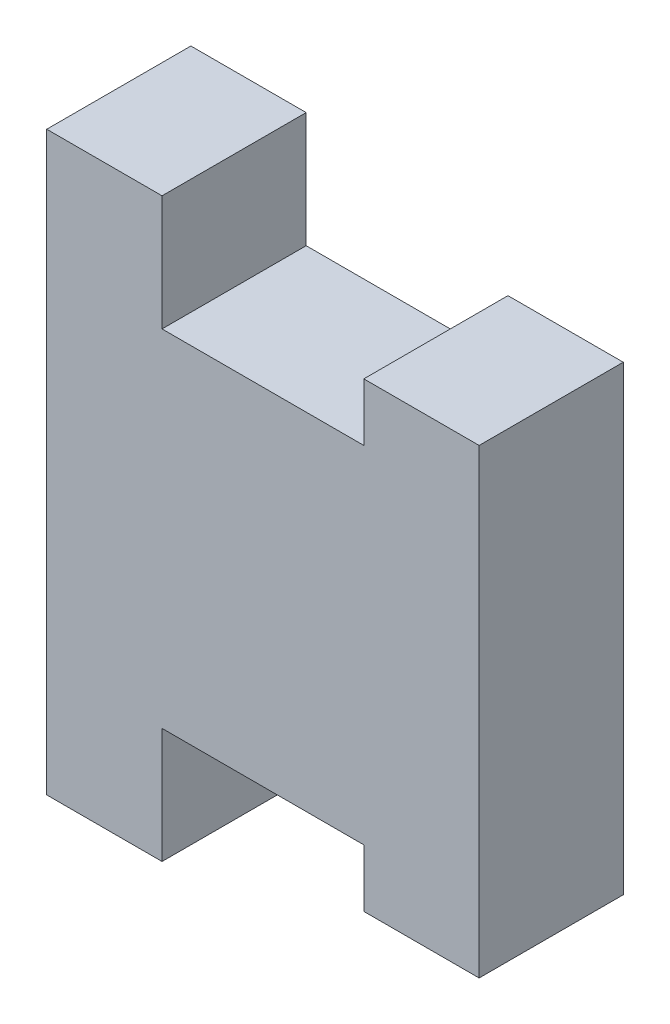
ISO-10303-21;
HEADER;
FILE_DESCRIPTION(('STEP AP214'),'2;1');
FILE_NAME('part.step','',(''),(''),'','','');
FILE_SCHEMA(('AUTOMOTIVE_DESIGN { 1 0 10303 214 1 1 1 1 }'));
ENDSEC;
DATA;
#1=APPLICATION_CONTEXT('core data for automotive mechanical design processes');
#2=APPLICATION_PROTOCOL_DEFINITION('international standard','automotive_design',2000,#1);
#3=PRODUCT_CONTEXT('',#1,'mechanical');
#4=PRODUCT('Part','Part','',(#3));
#5=PRODUCT_RELATED_PRODUCT_CATEGORY('part','',(#4));
#6=PRODUCT_DEFINITION_FORMATION('','',#4);
#7=PRODUCT_DEFINITION_CONTEXT('part definition',#1,'design');
#8=PRODUCT_DEFINITION('design','',#6,#7);
#9=PRODUCT_DEFINITION_SHAPE('','',#8);
#10=(LENGTH_UNIT() NAMED_UNIT(*) SI_UNIT(.MILLI.,.METRE.));
#11=(NAMED_UNIT(*) PLANE_ANGLE_UNIT() SI_UNIT($,.RADIAN.));
#12=(NAMED_UNIT(*) SI_UNIT($,.STERADIAN.) SOLID_ANGLE_UNIT());
#13=UNCERTAINTY_MEASURE_WITH_UNIT(LENGTH_MEASURE(1.E-05),#10,'distance_accuracy_value','');
#14=(GEOMETRIC_REPRESENTATION_CONTEXT(3) GLOBAL_UNCERTAINTY_ASSIGNED_CONTEXT((#13)) GLOBAL_UNIT_ASSIGNED_CONTEXT((#10,
#11,#12)) REPRESENTATION_CONTEXT('',''));
#15=CARTESIAN_POINT('',(0.,0.,0.));
#16=DIRECTION('',(0.,0.,1.));
#17=DIRECTION('',(1.,0.,0.));
#18=AXIS2_PLACEMENT_3D('',#15,#16,#17);
#19=CARTESIAN_POINT('',(0.2,0.,0.125));
#20=DIRECTION('',(0.,1.,0.));
#21=DIRECTION('',(0.,0.,1.));
#22=AXIS2_PLACEMENT_3D('',#19,#20,#21);
#23=PLANE('',#22);
#24=DIRECTION('',(1.,0.,0.));
#25=VECTOR('',#24,1.);
#26=CARTESIAN_POINT('',(0.2,0.,-0.125));
#27=LINE('',#26,#25);
#28=CARTESIAN_POINT('',(0.,0.,-0.125));
#29=VERTEX_POINT('',#28);
#30=CARTESIAN_POINT('',(0.2,0.,-0.125));
#31=VERTEX_POINT('',#30);
#32=EDGE_CURVE('E153',#29,#31,#27,.T.);
#33=ORIENTED_EDGE('',*,*,#32,.T.);
#34=DIRECTION('',(0.,0.,-1.));
#35=VECTOR('',#34,1.);
#36=CARTESIAN_POINT('',(0.2,0.,0.125));
#37=LINE('',#36,#35);
#38=CARTESIAN_POINT('',(0.2,0.,0.125));
#39=VERTEX_POINT('',#38);
#40=EDGE_CURVE('E11',#39,#31,#37,.T.);
#41=ORIENTED_EDGE('',*,*,#40,.F.);
#42=DIRECTION('',(1.,0.,0.));
#43=VECTOR('',#42,1.);
#44=CARTESIAN_POINT('',(0.2,0.,0.125));
#45=LINE('',#44,#43);
#46=CARTESIAN_POINT('',(0.,0.,0.125));
#47=VERTEX_POINT('',#46);
#48=EDGE_CURVE('E175',#47,#39,#45,.T.);
#49=ORIENTED_EDGE('',*,*,#48,.F.);
#50=DIRECTION('',(0.,0.,-1.));
#51=VECTOR('',#50,1.);
#52=CARTESIAN_POINT('',(0.,0.,0.125));
#53=LINE('',#52,#51);
#54=EDGE_CURVE('E149',#47,#29,#53,.T.);
#55=ORIENTED_EDGE('',*,*,#54,.T.);
#56=EDGE_LOOP('',(#33,#41,#49,#55));
#57=FACE_BOUND('',#56,.T.);
#58=ADVANCED_FACE('F33',(#57),#23,.F.);
#59=CARTESIAN_POINT('',(0.2,0.2,0.125));
#60=DIRECTION('',(-1.,0.,0.));
#61=DIRECTION('',(0.,-1.,0.));
#62=AXIS2_PLACEMENT_3D('',#59,#60,#61);
#63=PLANE('',#62);
#64=DIRECTION('',(0.,1.,0.));
#65=VECTOR('',#64,1.);
#66=CARTESIAN_POINT('',(0.2,0.2,-0.125));
#67=LINE('',#66,#65);
#68=CARTESIAN_POINT('',(0.2,0.2,-0.125));
#69=VERTEX_POINT('',#68);
#70=EDGE_CURVE('E156',#31,#69,#67,.T.);
#71=ORIENTED_EDGE('',*,*,#70,.T.);
#72=DIRECTION('',(0.,0.,-1.));
#73=VECTOR('',#72,1.);
#74=CARTESIAN_POINT('',(0.2,0.2,0.125));
#75=LINE('',#74,#73);
#76=CARTESIAN_POINT('',(0.2,0.2,0.125));
#77=VERTEX_POINT('',#76);
#78=EDGE_CURVE('E41',#77,#69,#75,.T.);
#79=ORIENTED_EDGE('',*,*,#78,.F.);
#80=DIRECTION('',(0.,1.,0.));
#81=VECTOR('',#80,1.);
#82=CARTESIAN_POINT('',(0.2,0.2,0.125));
#83=LINE('',#82,#81);
#84=EDGE_CURVE('E104',#39,#77,#83,.T.);
#85=ORIENTED_EDGE('',*,*,#84,.F.);
#86=ORIENTED_EDGE('',*,*,#40,.T.);
#87=EDGE_LOOP('',(#71,#79,#85,#86));
#88=FACE_BOUND('',#87,.T.);
#89=ADVANCED_FACE('F253',(#88),#63,.F.);
#90=CARTESIAN_POINT('',(0.55,0.2,0.125));
#91=DIRECTION('',(0.,1.,0.));
#92=DIRECTION('',(0.,0.,1.));
#93=AXIS2_PLACEMENT_3D('',#90,#91,#92);
#94=PLANE('',#93);
#95=DIRECTION('',(1.,0.,0.));
#96=VECTOR('',#95,1.);
#97=CARTESIAN_POINT('',(0.55,0.2,-0.125));
#98=LINE('',#97,#96);
#99=CARTESIAN_POINT('',(0.55,0.2,-0.125));
#100=VERTEX_POINT('',#99);
#101=EDGE_CURVE('E158',#69,#100,#98,.T.);
#102=ORIENTED_EDGE('',*,*,#101,.T.);
#103=DIRECTION('',(0.,0.,-1.));
#104=VECTOR('',#103,1.);
#105=CARTESIAN_POINT('',(0.55,0.2,0.125));
#106=LINE('',#105,#104);
#107=CARTESIAN_POINT('',(0.55,0.2,0.125));
#108=VERTEX_POINT('',#107);
#109=EDGE_CURVE('E194',#108,#100,#106,.T.);
#110=ORIENTED_EDGE('',*,*,#109,.F.);
#111=DIRECTION('',(1.,0.,0.));
#112=VECTOR('',#111,1.);
#113=CARTESIAN_POINT('',(0.55,0.2,0.125));
#114=LINE('',#113,#112);
#115=EDGE_CURVE('E202',#77,#108,#114,.T.);
#116=ORIENTED_EDGE('',*,*,#115,.F.);
#117=ORIENTED_EDGE('',*,*,#78,.T.);
#118=EDGE_LOOP('',(#102,#110,#116,#117));
#119=FACE_BOUND('',#118,.T.);
#120=ADVANCED_FACE('F200',(#119),#94,.F.);
#121=CARTESIAN_POINT('',(0.55,0.0999999999999999,0.125));
#122=DIRECTION('',(1.,0.,0.));
#123=DIRECTION('',(0.,0.,-1.));
#124=AXIS2_PLACEMENT_3D('',#121,#122,#123);
#125=PLANE('',#124);
#126=DIRECTION('',(0.,-1.,0.));
#127=VECTOR('',#126,1.);
#128=CARTESIAN_POINT('',(0.55,0.0999999999999999,-0.125));
#129=LINE('',#128,#127);
#130=CARTESIAN_POINT('',(0.55,0.0999999999999999,-0.125));
#131=VERTEX_POINT('',#130);
#132=EDGE_CURVE('E160',#100,#131,#129,.T.);
#133=ORIENTED_EDGE('',*,*,#132,.T.);
#134=DIRECTION('',(0.,0.,-1.));
#135=VECTOR('',#134,1.);
#136=CARTESIAN_POINT('',(0.55,0.0999999999999999,0.125));
#137=LINE('',#136,#135);
#138=CARTESIAN_POINT('',(0.55,0.0999999999999999,0.125));
#139=VERTEX_POINT('',#138);
#140=EDGE_CURVE('E191',#139,#131,#137,.T.);
#141=ORIENTED_EDGE('',*,*,#140,.F.);
#142=DIRECTION('',(0.,-1.,0.));
#143=VECTOR('',#142,1.);
#144=CARTESIAN_POINT('',(0.55,0.0999999999999999,0.125));
#145=LINE('',#144,#143);
#146=EDGE_CURVE('E220',#108,#139,#145,.T.);
#147=ORIENTED_EDGE('',*,*,#146,.F.);
#148=ORIENTED_EDGE('',*,*,#109,.T.);
#149=EDGE_LOOP('',(#133,#141,#147,#148));
#150=FACE_BOUND('',#149,.T.);
#151=ADVANCED_FACE('F211',(#150),#125,.F.);
#152=CARTESIAN_POINT('',(0.75,0.0999999999999999,0.125));
#153=DIRECTION('',(0.,1.,0.));
#154=DIRECTION('',(0.,0.,1.));
#155=AXIS2_PLACEMENT_3D('',#152,#153,#154);
#156=PLANE('',#155);
#157=DIRECTION('',(1.,0.,0.));
#158=VECTOR('',#157,1.);
#159=CARTESIAN_POINT('',(0.75,0.0999999999999999,-0.125));
#160=LINE('',#159,#158);
#161=CARTESIAN_POINT('',(0.75,0.0999999999999999,-0.125));
#162=VERTEX_POINT('',#161);
#163=EDGE_CURVE('E162',#131,#162,#160,.T.);
#164=ORIENTED_EDGE('',*,*,#163,.T.);
#165=DIRECTION('',(0.,0.,-1.));
#166=VECTOR('',#165,1.);
#167=CARTESIAN_POINT('',(0.75,0.0999999999999999,0.125));
#168=LINE('',#167,#166);
#169=CARTESIAN_POINT('',(0.75,0.0999999999999999,0.125));
#170=VERTEX_POINT('',#169);
#171=EDGE_CURVE('E188',#170,#162,#168,.T.);
#172=ORIENTED_EDGE('',*,*,#171,.F.);
#173=DIRECTION('',(1.,0.,0.));
#174=VECTOR('',#173,1.);
#175=CARTESIAN_POINT('',(0.75,0.0999999999999999,0.125));
#176=LINE('',#175,#174);
#177=EDGE_CURVE('E217',#139,#170,#176,.T.);
#178=ORIENTED_EDGE('',*,*,#177,.F.);
#179=ORIENTED_EDGE('',*,*,#140,.T.);
#180=EDGE_LOOP('',(#164,#172,#178,#179));
#181=FACE_BOUND('',#180,.T.);
#182=ADVANCED_FACE('F215',(#181),#156,.F.);
#183=CARTESIAN_POINT('',(0.75,0.9,0.125));
#184=DIRECTION('',(-1.,0.,0.));
#185=DIRECTION('',(0.,-1.,0.));
#186=AXIS2_PLACEMENT_3D('',#183,#184,#185);
#187=PLANE('',#186);
#188=DIRECTION('',(0.,1.,0.));
#189=VECTOR('',#188,1.);
#190=CARTESIAN_POINT('',(0.75,0.9,-0.125));
#191=LINE('',#190,#189);
#192=CARTESIAN_POINT('',(0.75,0.9,-0.125));
#193=VERTEX_POINT('',#192);
#194=EDGE_CURVE('E164',#162,#193,#191,.T.);
#195=ORIENTED_EDGE('',*,*,#194,.T.);
#196=DIRECTION('',(0.,0.,-1.));
#197=VECTOR('',#196,1.);
#198=CARTESIAN_POINT('',(0.75,0.9,0.125));
#199=LINE('',#198,#197);
#200=CARTESIAN_POINT('',(0.75,0.9,0.125));
#201=VERTEX_POINT('',#200);
#202=EDGE_CURVE('E185',#201,#193,#199,.T.);
#203=ORIENTED_EDGE('',*,*,#202,.F.);
#204=DIRECTION('',(0.,1.,0.));
#205=VECTOR('',#204,1.);
#206=CARTESIAN_POINT('',(0.75,0.9,0.125));
#207=LINE('',#206,#205);
#208=EDGE_CURVE('E219',#170,#201,#207,.T.);
#209=ORIENTED_EDGE('',*,*,#208,.F.);
#210=ORIENTED_EDGE('',*,*,#171,.T.);
#211=EDGE_LOOP('',(#195,#203,#209,#210));
#212=FACE_BOUND('',#211,.T.);
#213=ADVANCED_FACE('F266',(#212),#187,.F.);
#214=CARTESIAN_POINT('',(0.55,0.9,0.125));
#215=DIRECTION('',(0.,-1.,0.));
#216=DIRECTION('',(1.,0.,0.));
#217=AXIS2_PLACEMENT_3D('',#214,#215,#216);
#218=PLANE('',#217);
#219=DIRECTION('',(-1.,0.,0.));
#220=VECTOR('',#219,1.);
#221=CARTESIAN_POINT('',(0.55,0.9,-0.125));
#222=LINE('',#221,#220);
#223=CARTESIAN_POINT('',(0.55,0.9,-0.125));
#224=VERTEX_POINT('',#223);
#225=EDGE_CURVE('E166',#193,#224,#222,.T.);
#226=ORIENTED_EDGE('',*,*,#225,.T.);
#227=DIRECTION('',(0.,0.,-1.));
#228=VECTOR('',#227,1.);
#229=CARTESIAN_POINT('',(0.55,0.9,0.125));
#230=LINE('',#229,#228);
#231=CARTESIAN_POINT('',(0.55,0.9,0.125));
#232=VERTEX_POINT('',#231);
#233=EDGE_CURVE('E182',#232,#224,#230,.T.);
#234=ORIENTED_EDGE('',*,*,#233,.F.);
#235=DIRECTION('',(-1.,0.,0.));
#236=VECTOR('',#235,1.);
#237=CARTESIAN_POINT('',(0.55,0.9,0.125));
#238=LINE('',#237,#236);
#239=EDGE_CURVE('E222',#201,#232,#238,.T.);
#240=ORIENTED_EDGE('',*,*,#239,.F.);
#241=ORIENTED_EDGE('',*,*,#202,.T.);
#242=EDGE_LOOP('',(#226,#234,#240,#241));
#243=FACE_BOUND('',#242,.T.);
#244=ADVANCED_FACE('F269',(#243),#218,.F.);
#245=CARTESIAN_POINT('',(0.55,0.8,0.125));
#246=DIRECTION('',(1.,0.,0.));
#247=DIRECTION('',(0.,0.,-1.));
#248=AXIS2_PLACEMENT_3D('',#245,#246,#247);
#249=PLANE('',#248);
#250=DIRECTION('',(0.,-1.,0.));
#251=VECTOR('',#250,1.);
#252=CARTESIAN_POINT('',(0.55,0.8,-0.125));
#253=LINE('',#252,#251);
#254=CARTESIAN_POINT('',(0.55,0.8,-0.125));
#255=VERTEX_POINT('',#254);
#256=EDGE_CURVE('E168',#224,#255,#253,.T.);
#257=ORIENTED_EDGE('',*,*,#256,.T.);
#258=DIRECTION('',(0.,0.,-1.));
#259=VECTOR('',#258,1.);
#260=CARTESIAN_POINT('',(0.55,0.8,0.125));
#261=LINE('',#260,#259);
#262=CARTESIAN_POINT('',(0.55,0.8,0.125));
#263=VERTEX_POINT('',#262);
#264=EDGE_CURVE('E179',#263,#255,#261,.T.);
#265=ORIENTED_EDGE('',*,*,#264,.F.);
#266=DIRECTION('',(0.,-1.,0.));
#267=VECTOR('',#266,1.);
#268=CARTESIAN_POINT('',(0.55,0.8,0.125));
#269=LINE('',#268,#267);
#270=EDGE_CURVE('E228',#232,#263,#269,.T.);
#271=ORIENTED_EDGE('',*,*,#270,.F.);
#272=ORIENTED_EDGE('',*,*,#233,.T.);
#273=EDGE_LOOP('',(#257,#265,#271,#272));
#274=FACE_BOUND('',#273,.T.);
#275=ADVANCED_FACE('F234',(#274),#249,.F.);
#276=CARTESIAN_POINT('',(0.2,0.8,0.125));
#277=DIRECTION('',(0.,-1.,0.));
#278=DIRECTION('',(0.,0.,-1.));
#279=AXIS2_PLACEMENT_3D('',#276,#277,#278);
#280=PLANE('',#279);
#281=DIRECTION('',(-1.,0.,0.));
#282=VECTOR('',#281,1.);
#283=CARTESIAN_POINT('',(0.2,0.8,-0.125));
#284=LINE('',#283,#282);
#285=CARTESIAN_POINT('',(0.2,0.8,-0.125));
#286=VERTEX_POINT('',#285);
#287=EDGE_CURVE('E170',#255,#286,#284,.T.);
#288=ORIENTED_EDGE('',*,*,#287,.T.);
#289=DIRECTION('',(0.,0.,-1.));
#290=VECTOR('',#289,1.);
#291=CARTESIAN_POINT('',(0.2,0.8,0.125));
#292=LINE('',#291,#290);
#293=CARTESIAN_POINT('',(0.2,0.8,0.125));
#294=VERTEX_POINT('',#293);
#295=EDGE_CURVE('E144',#294,#286,#292,.T.);
#296=ORIENTED_EDGE('',*,*,#295,.F.);
#297=DIRECTION('',(-1.,0.,0.));
#298=VECTOR('',#297,1.);
#299=CARTESIAN_POINT('',(0.2,0.8,0.125));
#300=LINE('',#299,#298);
#301=EDGE_CURVE('E135',#263,#294,#300,.T.);
#302=ORIENTED_EDGE('',*,*,#301,.F.);
#303=ORIENTED_EDGE('',*,*,#264,.T.);
#304=EDGE_LOOP('',(#288,#296,#302,#303));
#305=FACE_BOUND('',#304,.T.);
#306=ADVANCED_FACE('F238',(#305),#280,.F.);
#307=CARTESIAN_POINT('',(0.2,1.,0.125));
#308=DIRECTION('',(-1.,0.,0.));
#309=DIRECTION('',(0.,0.,1.));
#310=AXIS2_PLACEMENT_3D('',#307,#308,#309);
#311=PLANE('',#310);
#312=DIRECTION('',(0.,1.,0.));
#313=VECTOR('',#312,1.);
#314=CARTESIAN_POINT('',(0.2,1.,-0.125));
#315=LINE('',#314,#313);
#316=CARTESIAN_POINT('',(0.2,1.,-0.125));
#317=VERTEX_POINT('',#316);
#318=EDGE_CURVE('E143',#286,#317,#315,.T.);
#319=ORIENTED_EDGE('',*,*,#318,.T.);
#320=DIRECTION('',(0.,0.,-1.));
#321=VECTOR('',#320,1.);
#322=CARTESIAN_POINT('',(0.2,1.,0.125));
#323=LINE('',#322,#321);
#324=CARTESIAN_POINT('',(0.2,1.,0.125));
#325=VERTEX_POINT('',#324);
#326=EDGE_CURVE('E140',#325,#317,#323,.T.);
#327=ORIENTED_EDGE('',*,*,#326,.F.);
#328=DIRECTION('',(0.,1.,0.));
#329=VECTOR('',#328,1.);
#330=CARTESIAN_POINT('',(0.2,1.,0.125));
#331=LINE('',#330,#329);
#332=EDGE_CURVE('E129',#294,#325,#331,.T.);
#333=ORIENTED_EDGE('',*,*,#332,.F.);
#334=ORIENTED_EDGE('',*,*,#295,.T.);
#335=EDGE_LOOP('',(#319,#327,#333,#334));
#336=FACE_BOUND('',#335,.T.);
#337=ADVANCED_FACE('F141',(#336),#311,.F.);
#338=CARTESIAN_POINT('',(0.,1.,0.125));
#339=DIRECTION('',(0.,-1.,0.));
#340=DIRECTION('',(0.,0.,-1.));
#341=AXIS2_PLACEMENT_3D('',#338,#339,#340);
#342=PLANE('',#341);
#343=DIRECTION('',(-1.,0.,0.));
#344=VECTOR('',#343,1.);
#345=CARTESIAN_POINT('',(0.,1.,-0.125));
#346=LINE('',#345,#344);
#347=CARTESIAN_POINT('',(0.,1.,-0.125));
#348=VERTEX_POINT('',#347);
#349=EDGE_CURVE('E90',#317,#348,#346,.T.);
#350=ORIENTED_EDGE('',*,*,#349,.T.);
#351=DIRECTION('',(0.,0.,-1.));
#352=VECTOR('',#351,1.);
#353=CARTESIAN_POINT('',(0.,1.,0.125));
#354=LINE('',#353,#352);
#355=CARTESIAN_POINT('',(0.,1.,0.125));
#356=VERTEX_POINT('',#355);
#357=EDGE_CURVE('E145',#356,#348,#354,.T.);
#358=ORIENTED_EDGE('',*,*,#357,.F.);
#359=DIRECTION('',(-1.,0.,0.));
#360=VECTOR('',#359,1.);
#361=CARTESIAN_POINT('',(0.,1.,0.125));
#362=LINE('',#361,#360);
#363=EDGE_CURVE('E133',#325,#356,#362,.T.);
#364=ORIENTED_EDGE('',*,*,#363,.F.);
#365=ORIENTED_EDGE('',*,*,#326,.T.);
#366=EDGE_LOOP('',(#350,#358,#364,#365));
#367=FACE_BOUND('',#366,.T.);
#368=ADVANCED_FACE('F147',(#367),#342,.F.);
#369=CARTESIAN_POINT('',(0.,0.,0.125));
#370=DIRECTION('',(1.,0.,0.));
#371=DIRECTION('',(0.,0.,-1.));
#372=AXIS2_PLACEMENT_3D('',#369,#370,#371);
#373=PLANE('',#372);
#374=DIRECTION('',(0.,-1.,0.));
#375=VECTOR('',#374,1.);
#376=CARTESIAN_POINT('',(0.,0.,-0.125));
#377=LINE('',#376,#375);
#378=EDGE_CURVE('E96',#348,#29,#377,.T.);
#379=ORIENTED_EDGE('',*,*,#378,.T.);
#380=ORIENTED_EDGE('',*,*,#54,.F.);
#381=DIRECTION('',(0.,-1.,0.));
#382=VECTOR('',#381,1.);
#383=CARTESIAN_POINT('',(0.,0.,0.125));
#384=LINE('',#383,#382);
#385=EDGE_CURVE('E49',#356,#47,#384,.T.);
#386=ORIENTED_EDGE('',*,*,#385,.F.);
#387=ORIENTED_EDGE('',*,*,#357,.T.);
#388=EDGE_LOOP('',(#379,#380,#386,#387));
#389=FACE_BOUND('',#388,.T.);
#390=ADVANCED_FACE('F242',(#389),#373,.F.);
#391=CARTESIAN_POINT('',(0.,0.,0.125));
#392=DIRECTION('',(0.,0.,-1.));
#393=DIRECTION('',(-1.,0.,0.));
#394=AXIS2_PLACEMENT_3D('',#391,#392,#393);
#395=PLANE('',#394);
#396=ORIENTED_EDGE('',*,*,#48,.T.);
#397=ORIENTED_EDGE('',*,*,#84,.T.);
#398=ORIENTED_EDGE('',*,*,#115,.T.);
#399=ORIENTED_EDGE('',*,*,#146,.T.);
#400=ORIENTED_EDGE('',*,*,#177,.T.);
#401=ORIENTED_EDGE('',*,*,#208,.T.);
#402=ORIENTED_EDGE('',*,*,#239,.T.);
#403=ORIENTED_EDGE('',*,*,#270,.T.);
#404=ORIENTED_EDGE('',*,*,#301,.T.);
#405=ORIENTED_EDGE('',*,*,#332,.T.);
#406=ORIENTED_EDGE('',*,*,#363,.T.);
#407=ORIENTED_EDGE('',*,*,#385,.T.);
#408=EDGE_LOOP('',(#396,#397,#398,#399,#400,#401,#402,#403,#404,#405,#406,#407));
#409=FACE_BOUND('',#408,.T.);
#410=ADVANCED_FACE('F131',(#409),#395,.F.);
#411=CARTESIAN_POINT('',(0.,0.,-0.125));
#412=DIRECTION('',(0.,0.,-1.));
#413=DIRECTION('',(-1.,0.,0.));
#414=AXIS2_PLACEMENT_3D('',#411,#412,#413);
#415=PLANE('',#414);
#416=ORIENTED_EDGE('',*,*,#32,.F.);
#417=ORIENTED_EDGE('',*,*,#378,.F.);
#418=ORIENTED_EDGE('',*,*,#349,.F.);
#419=ORIENTED_EDGE('',*,*,#318,.F.);
#420=ORIENTED_EDGE('',*,*,#287,.F.);
#421=ORIENTED_EDGE('',*,*,#256,.F.);
#422=ORIENTED_EDGE('',*,*,#225,.F.);
#423=ORIENTED_EDGE('',*,*,#194,.F.);
#424=ORIENTED_EDGE('',*,*,#163,.F.);
#425=ORIENTED_EDGE('',*,*,#132,.F.);
#426=ORIENTED_EDGE('',*,*,#101,.F.);
#427=ORIENTED_EDGE('',*,*,#70,.F.);
#428=EDGE_LOOP('',(#416,#417,#418,#419,#420,#421,#422,#423,#424,#425,#426,#427));
#429=FACE_BOUND('',#428,.T.);
#430=ADVANCED_FACE('F206',(#429),#415,.T.);
#431=CLOSED_SHELL('',(#58,#89,#120,#151,#182,#213,#244,#275,#306,#337,#368,#390,#410,#430));
#432=MANIFOLD_SOLID_BREP('B2',#431);
#433=ADVANCED_BREP_SHAPE_REPRESENTATION('',(#18,#432),#14);
#434=SHAPE_DEFINITION_REPRESENTATION(#9,#433);
ENDSEC;
END-ISO-10303-21;
